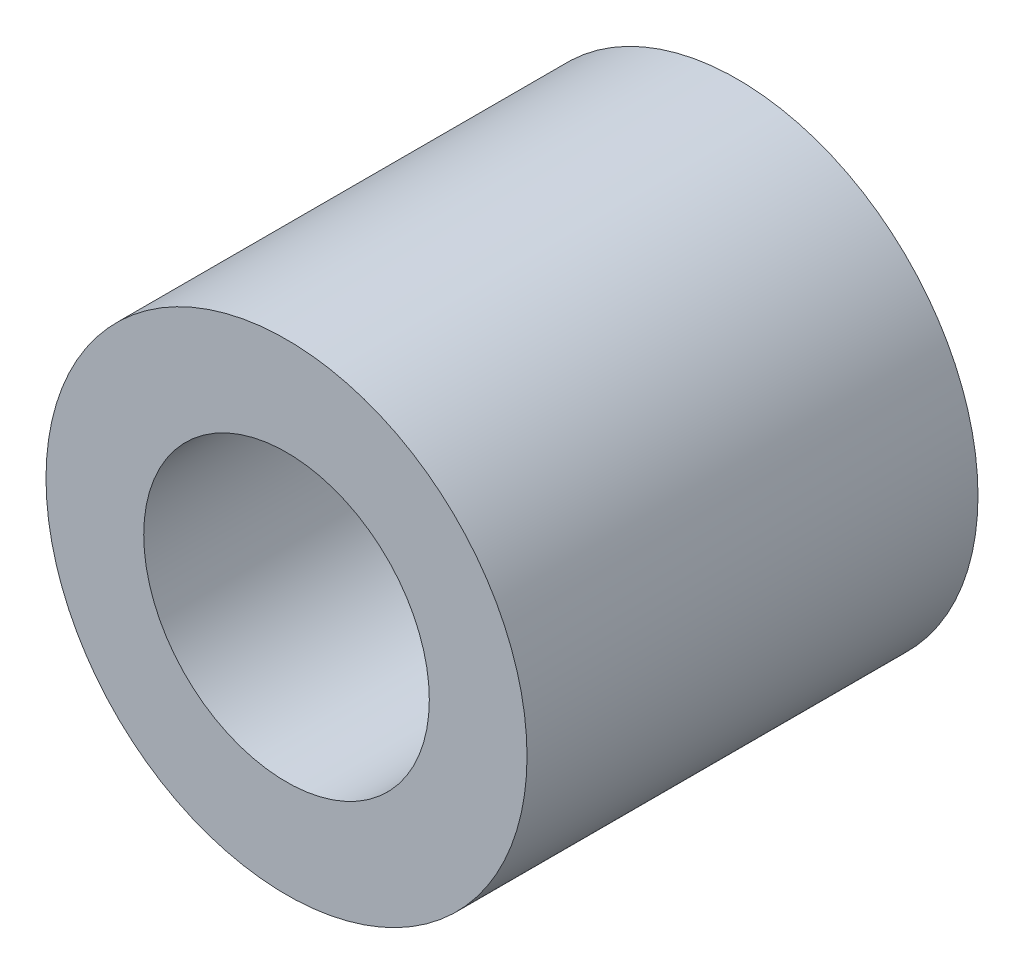
ISO-10303-21;
HEADER;
FILE_DESCRIPTION(('STEP AP214'),'2;1');
FILE_NAME('part.step','',(''),(''),'','','');
FILE_SCHEMA(('AUTOMOTIVE_DESIGN { 1 0 10303 214 1 1 1 1 }'));
ENDSEC;
DATA;
#1=APPLICATION_CONTEXT('core data for automotive mechanical design processes');
#2=APPLICATION_PROTOCOL_DEFINITION('international standard','automotive_design',2000,#1);
#3=PRODUCT_CONTEXT('',#1,'mechanical');
#4=PRODUCT('Part','Part','',(#3));
#5=PRODUCT_RELATED_PRODUCT_CATEGORY('part','',(#4));
#6=PRODUCT_DEFINITION_FORMATION('','',#4);
#7=PRODUCT_DEFINITION_CONTEXT('part definition',#1,'design');
#8=PRODUCT_DEFINITION('design','',#6,#7);
#9=PRODUCT_DEFINITION_SHAPE('','',#8);
#10=(LENGTH_UNIT() NAMED_UNIT(*) SI_UNIT(.MILLI.,.METRE.));
#11=(NAMED_UNIT(*) PLANE_ANGLE_UNIT() SI_UNIT($,.RADIAN.));
#12=(NAMED_UNIT(*) SI_UNIT($,.STERADIAN.) SOLID_ANGLE_UNIT());
#13=UNCERTAINTY_MEASURE_WITH_UNIT(LENGTH_MEASURE(1.E-05),#10,'distance_accuracy_value','');
#14=(GEOMETRIC_REPRESENTATION_CONTEXT(3) GLOBAL_UNCERTAINTY_ASSIGNED_CONTEXT((#13)) GLOBAL_UNIT_ASSIGNED_CONTEXT((#10,
#11,#12)) REPRESENTATION_CONTEXT('',''));
#15=CARTESIAN_POINT('',(0.,0.,0.));
#16=DIRECTION('',(0.,0.,1.));
#17=DIRECTION('',(1.,0.,0.));
#18=AXIS2_PLACEMENT_3D('',#15,#16,#17);
#19=CARTESIAN_POINT('',(0.,0.,-15.));
#20=DIRECTION('',(0.,0.,1.));
#21=DIRECTION('',(1.,0.,0.));
#22=AXIS2_PLACEMENT_3D('',#19,#20,#21);
#23=CYLINDRICAL_SURFACE('',#22,8.);
#24=CARTESIAN_POINT('',(0.,0.,-15.));
#25=DIRECTION('',(0.,0.,1.));
#26=DIRECTION('',(1.,0.,0.));
#27=AXIS2_PLACEMENT_3D('',#24,#25,#26);
#28=CIRCLE('',#27,8.);
#29=CARTESIAN_POINT('',(8.,0.,-15.));
#30=VERTEX_POINT('',#29);
#31=EDGE_CURVE('E10',#30,#30,#28,.T.);
#32=ORIENTED_EDGE('',*,*,#31,.T.);
#33=EDGE_LOOP('',(#32));
#34=FACE_BOUND('',#33,.T.);
#35=CARTESIAN_POINT('',(0.,0.,0.));
#36=DIRECTION('',(0.,0.,1.));
#37=DIRECTION('',(1.,0.,0.));
#38=AXIS2_PLACEMENT_3D('',#35,#36,#37);
#39=CIRCLE('',#38,8.);
#40=CARTESIAN_POINT('',(8.,0.,0.));
#41=VERTEX_POINT('',#40);
#42=EDGE_CURVE('E33',#41,#41,#39,.T.);
#43=ORIENTED_EDGE('',*,*,#42,.F.);
#44=EDGE_LOOP('',(#43));
#45=FACE_BOUND('',#44,.T.);
#46=ADVANCED_FACE('F30',(#34,#45),#23,.T.);
#47=CARTESIAN_POINT('',(0.,0.,-15.));
#48=DIRECTION('',(0.,0.,1.));
#49=DIRECTION('',(1.,0.,0.));
#50=AXIS2_PLACEMENT_3D('',#47,#48,#49);
#51=PLANE('',#50);
#52=CARTESIAN_POINT('',(0.,0.,-15.));
#53=DIRECTION('',(0.,0.,1.));
#54=DIRECTION('',(1.,0.,0.));
#55=AXIS2_PLACEMENT_3D('',#52,#53,#54);
#56=CIRCLE('',#55,4.75);
#57=CARTESIAN_POINT('',(4.75,0.,-15.));
#58=VERTEX_POINT('',#57);
#59=EDGE_CURVE('E40',#58,#58,#56,.T.);
#60=ORIENTED_EDGE('',*,*,#59,.T.);
#61=EDGE_LOOP('',(#60));
#62=FACE_BOUND('',#61,.T.);
#63=ORIENTED_EDGE('',*,*,#31,.F.);
#64=EDGE_LOOP('',(#63));
#65=FACE_BOUND('',#64,.T.);
#66=ADVANCED_FACE('F48',(#62,#65),#51,.F.);
#67=CARTESIAN_POINT('',(0.,0.,0.));
#68=DIRECTION('',(0.,0.,1.));
#69=DIRECTION('',(1.,0.,0.));
#70=AXIS2_PLACEMENT_3D('',#67,#68,#69);
#71=PLANE('',#70);
#72=CARTESIAN_POINT('',(0.,0.,0.));
#73=DIRECTION('',(0.,0.,1.));
#74=DIRECTION('',(1.,0.,0.));
#75=AXIS2_PLACEMENT_3D('',#72,#73,#74);
#76=CIRCLE('',#75,4.75);
#77=CARTESIAN_POINT('',(4.75,0.,0.));
#78=VERTEX_POINT('',#77);
#79=EDGE_CURVE('E42',#78,#78,#76,.T.);
#80=ORIENTED_EDGE('',*,*,#79,.F.);
#81=EDGE_LOOP('',(#80));
#82=FACE_BOUND('',#81,.T.);
#83=ORIENTED_EDGE('',*,*,#42,.T.);
#84=EDGE_LOOP('',(#83));
#85=FACE_BOUND('',#84,.T.);
#86=ADVANCED_FACE('F54',(#82,#85),#71,.T.);
#87=CARTESIAN_POINT('',(0.,0.,-15.));
#88=DIRECTION('',(0.,0.,1.));
#89=DIRECTION('',(1.,0.,0.));
#90=AXIS2_PLACEMENT_3D('',#87,#88,#89);
#91=CYLINDRICAL_SURFACE('',#90,4.75);
#92=ORIENTED_EDGE('',*,*,#59,.F.);
#93=EDGE_LOOP('',(#92));
#94=FACE_BOUND('',#93,.T.);
#95=ORIENTED_EDGE('',*,*,#79,.T.);
#96=EDGE_LOOP('',(#95));
#97=FACE_BOUND('',#96,.T.);
#98=ADVANCED_FACE('F51',(#94,#97),#91,.F.);
#99=CLOSED_SHELL('',(#46,#66,#86,#98));
#100=MANIFOLD_SOLID_BREP('B2',#99);
#101=ADVANCED_BREP_SHAPE_REPRESENTATION('',(#18,#100),#14);
#102=SHAPE_DEFINITION_REPRESENTATION(#9,#101);
ENDSEC;
END-ISO-10303-21;
